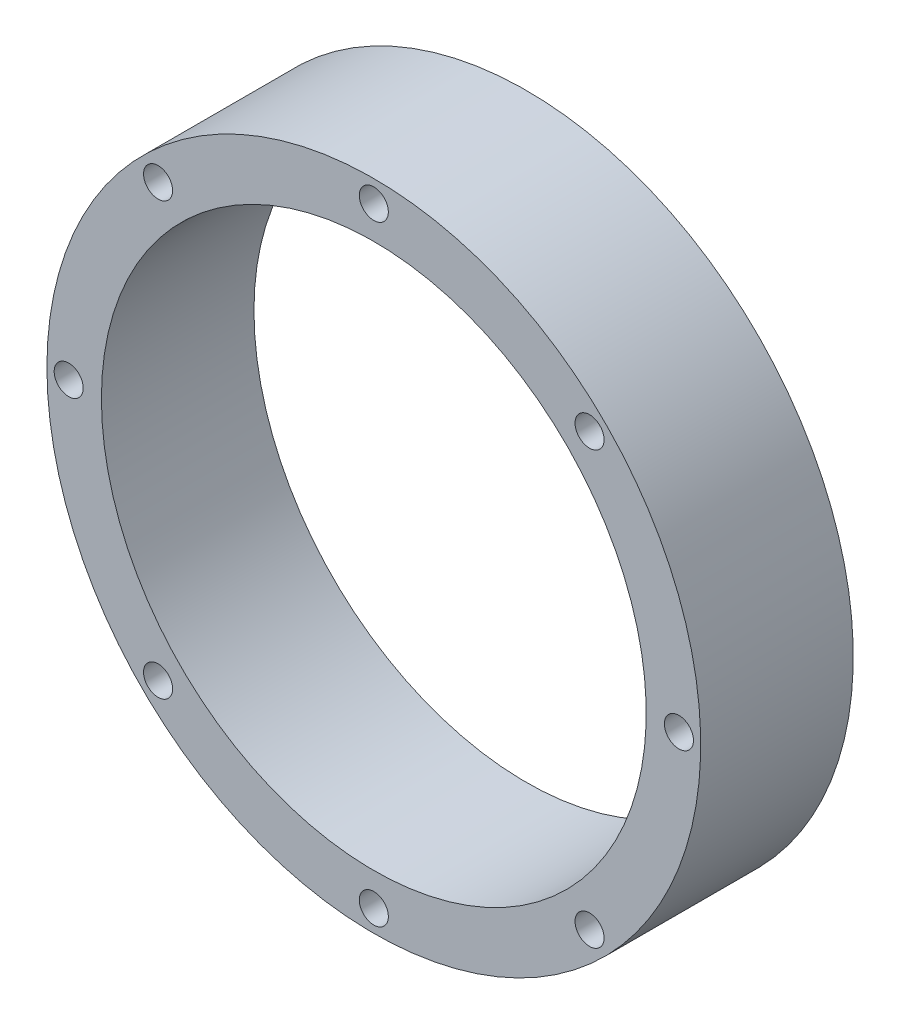
ISO-10303-21;
HEADER;
FILE_DESCRIPTION(('STEP AP214'),'2;1');
FILE_NAME('part.step','',(''),(''),'','','');
FILE_SCHEMA(('AUTOMOTIVE_DESIGN { 1 0 10303 214 1 1 1 1 }'));
ENDSEC;
DATA;
#1=APPLICATION_CONTEXT('core data for automotive mechanical design processes');
#2=APPLICATION_PROTOCOL_DEFINITION('international standard','automotive_design',2000,#1);
#3=PRODUCT_CONTEXT('',#1,'mechanical');
#4=PRODUCT('Part','Part','',(#3));
#5=PRODUCT_RELATED_PRODUCT_CATEGORY('part','',(#4));
#6=PRODUCT_DEFINITION_FORMATION('','',#4);
#7=PRODUCT_DEFINITION_CONTEXT('part definition',#1,'design');
#8=PRODUCT_DEFINITION('design','',#6,#7);
#9=PRODUCT_DEFINITION_SHAPE('','',#8);
#10=(LENGTH_UNIT() NAMED_UNIT(*) SI_UNIT(.MILLI.,.METRE.));
#11=(NAMED_UNIT(*) PLANE_ANGLE_UNIT() SI_UNIT($,.RADIAN.));
#12=(NAMED_UNIT(*) SI_UNIT($,.STERADIAN.) SOLID_ANGLE_UNIT());
#13=UNCERTAINTY_MEASURE_WITH_UNIT(LENGTH_MEASURE(1.E-05),#10,'distance_accuracy_value','');
#14=(GEOMETRIC_REPRESENTATION_CONTEXT(3) GLOBAL_UNCERTAINTY_ASSIGNED_CONTEXT((#13)) GLOBAL_UNIT_ASSIGNED_CONTEXT((#10,
#11,#12)) REPRESENTATION_CONTEXT('',''));
#15=CARTESIAN_POINT('',(0.,0.,0.));
#16=DIRECTION('',(0.,0.,1.));
#17=DIRECTION('',(1.,0.,0.));
#18=AXIS2_PLACEMENT_3D('',#15,#16,#17);
#19=CARTESIAN_POINT('',(0.,0.,21.));
#20=DIRECTION('',(0.,0.,1.));
#21=DIRECTION('',(1.,0.,0.));
#22=AXIS2_PLACEMENT_3D('',#19,#20,#21);
#23=PLANE('',#22);
#24=CARTESIAN_POINT('',(-29.6984848098345,29.6984848098337,21.));
#25=DIRECTION('',(0.,0.,-1.));
#26=DIRECTION('',(-1.,0.,0.));
#27=AXIS2_PLACEMENT_3D('',#24,#25,#26);
#28=CIRCLE('',#27,1.99999999999999);
#29=CARTESIAN_POINT('',(-31.6984848098345,29.6984848098337,21.));
#30=VERTEX_POINT('',#29);
#31=EDGE_CURVE('E150',#30,#30,#28,.T.);
#32=ORIENTED_EDGE('',*,*,#31,.T.);
#33=EDGE_LOOP('',(#32));
#34=FACE_BOUND('',#33,.T.);
#35=CARTESIAN_POINT('',(0.,42.,21.));
#36=DIRECTION('',(0.,0.,-1.));
#37=DIRECTION('',(-1.,0.,0.));
#38=AXIS2_PLACEMENT_3D('',#35,#36,#37);
#39=CIRCLE('',#38,2.);
#40=CARTESIAN_POINT('',(-2.,42.,21.));
#41=VERTEX_POINT('',#40);
#42=EDGE_CURVE('E138',#41,#41,#39,.T.);
#43=ORIENTED_EDGE('',*,*,#42,.T.);
#44=EDGE_LOOP('',(#43));
#45=FACE_BOUND('',#44,.T.);
#46=CARTESIAN_POINT('',(0.,0.,21.));
#47=DIRECTION('',(0.,0.,1.));
#48=DIRECTION('',(1.,0.,0.));
#49=AXIS2_PLACEMENT_3D('',#46,#47,#48);
#50=CIRCLE('',#49,37.5);
#51=CARTESIAN_POINT('',(-37.5,0.,21.));
#52=VERTEX_POINT('',#51);
#53=EDGE_CURVE('E10',#52,#52,#50,.T.);
#54=ORIENTED_EDGE('',*,*,#53,.F.);
#55=EDGE_LOOP('',(#54));
#56=FACE_BOUND('',#55,.T.);
#57=CARTESIAN_POINT('',(0.,0.,21.));
#58=DIRECTION('',(0.,0.,1.));
#59=DIRECTION('',(1.,0.,0.));
#60=AXIS2_PLACEMENT_3D('',#57,#58,#59);
#61=CIRCLE('',#60,45.);
#62=CARTESIAN_POINT('',(-45.,0.,21.));
#63=VERTEX_POINT('',#62);
#64=EDGE_CURVE('E49',#63,#63,#61,.T.);
#65=ORIENTED_EDGE('',*,*,#64,.T.);
#66=EDGE_LOOP('',(#65));
#67=FACE_BOUND('',#66,.T.);
#68=CARTESIAN_POINT('',(-41.9999999999982,-1.78799593583724E-12,21.));
#69=DIRECTION('',(0.,0.,-1.));
#70=DIRECTION('',(-1.,0.,0.));
#71=AXIS2_PLACEMENT_3D('',#68,#69,#70);
#72=CIRCLE('',#71,1.99999999999999);
#73=CARTESIAN_POINT('',(-43.9999999999982,-1.78799593583724E-12,21.));
#74=VERTEX_POINT('',#73);
#75=EDGE_CURVE('E60',#74,#74,#72,.T.);
#76=ORIENTED_EDGE('',*,*,#75,.T.);
#77=EDGE_LOOP('',(#76));
#78=FACE_BOUND('',#77,.T.);
#79=CARTESIAN_POINT('',(-29.698484809832,-29.6984848098363,21.));
#80=DIRECTION('',(0.,0.,-1.));
#81=DIRECTION('',(-1.,0.,0.));
#82=AXIS2_PLACEMENT_3D('',#79,#80,#81);
#83=CIRCLE('',#82,1.99999999999999);
#84=CARTESIAN_POINT('',(-31.6984848098319,-29.6984848098363,21.));
#85=VERTEX_POINT('',#84);
#86=EDGE_CURVE('E78',#85,#85,#83,.T.);
#87=ORIENTED_EDGE('',*,*,#86,.T.);
#88=EDGE_LOOP('',(#87));
#89=FACE_BOUND('',#88,.T.);
#90=CARTESIAN_POINT('',(3.56570483856165E-12,-42.,21.));
#91=DIRECTION('',(0.,0.,-1.));
#92=DIRECTION('',(-1.,0.,0.));
#93=AXIS2_PLACEMENT_3D('',#90,#91,#92);
#94=CIRCLE('',#93,2.);
#95=CARTESIAN_POINT('',(-1.99999999999643,-42.,21.));
#96=VERTEX_POINT('',#95);
#97=EDGE_CURVE('E90',#96,#96,#94,.T.);
#98=ORIENTED_EDGE('',*,*,#97,.T.);
#99=EDGE_LOOP('',(#98));
#100=FACE_BOUND('',#99,.T.);
#101=CARTESIAN_POINT('',(29.698484809838,-29.6984848098337,21.));
#102=DIRECTION('',(0.,0.,-1.));
#103=DIRECTION('',(-1.,0.,0.));
#104=AXIS2_PLACEMENT_3D('',#101,#102,#103);
#105=CIRCLE('',#104,2.);
#106=CARTESIAN_POINT('',(27.698484809838,-29.6984848098337,21.));
#107=VERTEX_POINT('',#106);
#108=EDGE_CURVE('E102',#107,#107,#105,.T.);
#109=ORIENTED_EDGE('',*,*,#108,.T.);
#110=EDGE_LOOP('',(#109));
#111=FACE_BOUND('',#110,.T.);
#112=CARTESIAN_POINT('',(42.0000000000018,1.78285241928082E-12,21.));
#113=DIRECTION('',(0.,0.,-1.));
#114=DIRECTION('',(-1.,0.,0.));
#115=AXIS2_PLACEMENT_3D('',#112,#113,#114);
#116=CIRCLE('',#115,1.99999999999999);
#117=CARTESIAN_POINT('',(40.0000000000018,1.78285241928082E-12,21.));
#118=VERTEX_POINT('',#117);
#119=EDGE_CURVE('E114',#118,#118,#116,.T.);
#120=ORIENTED_EDGE('',*,*,#119,.T.);
#121=EDGE_LOOP('',(#120));
#122=FACE_BOUND('',#121,.T.);
#123=CARTESIAN_POINT('',(29.6984848098355,29.6984848098363,21.));
#124=DIRECTION('',(0.,0.,-1.));
#125=DIRECTION('',(-1.,0.,0.));
#126=AXIS2_PLACEMENT_3D('',#123,#124,#125);
#127=CIRCLE('',#126,2.);
#128=CARTESIAN_POINT('',(27.6984848098355,29.6984848098363,21.));
#129=VERTEX_POINT('',#128);
#130=EDGE_CURVE('E126',#129,#129,#127,.T.);
#131=ORIENTED_EDGE('',*,*,#130,.T.);
#132=EDGE_LOOP('',(#131));
#133=FACE_BOUND('',#132,.T.);
#134=ADVANCED_FACE('F40',(#34,#45,#56,#67,#78,#89,#100,#111,#122,#133),#23,.T.);
#135=CARTESIAN_POINT('',(0.,0.,21.));
#136=DIRECTION('',(0.,0.,-1.));
#137=DIRECTION('',(-1.,0.,0.));
#138=AXIS2_PLACEMENT_3D('',#135,#136,#137);
#139=CYLINDRICAL_SURFACE('',#138,45.);
#140=CARTESIAN_POINT('',(0.,0.,0.));
#141=DIRECTION('',(0.,0.,1.));
#142=DIRECTION('',(1.,0.,0.));
#143=AXIS2_PLACEMENT_3D('',#140,#141,#142);
#144=CIRCLE('',#143,45.);
#145=CARTESIAN_POINT('',(-45.,0.,0.));
#146=VERTEX_POINT('',#145);
#147=EDGE_CURVE('E57',#146,#146,#144,.T.);
#148=CARTESIAN_POINT('',(-45.,0.,21.));
#149=CARTESIAN_POINT('',(-45.,0.,20.78125));
#150=CARTESIAN_POINT('',(-45.,0.,20.5625));
#151=CARTESIAN_POINT('',(-45.,0.,20.125));
#152=CARTESIAN_POINT('',(-45.,0.,19.90625));
#153=CARTESIAN_POINT('',(-45.,0.,19.46875));
#154=CARTESIAN_POINT('',(-45.,0.,19.25));
#155=CARTESIAN_POINT('',(-45.,0.,18.8125));
#156=CARTESIAN_POINT('',(-45.,0.,18.59375));
#157=CARTESIAN_POINT('',(-45.,0.,18.15625));
#158=CARTESIAN_POINT('',(-45.,0.,17.9375));
#159=CARTESIAN_POINT('',(-45.,0.,17.5));
#160=CARTESIAN_POINT('',(-45.,0.,17.28125));
#161=CARTESIAN_POINT('',(-45.,0.,16.84375));
#162=CARTESIAN_POINT('',(-45.,0.,16.625));
#163=CARTESIAN_POINT('',(-45.,0.,16.1875));
#164=CARTESIAN_POINT('',(-45.,0.,15.96875));
#165=CARTESIAN_POINT('',(-45.,0.,15.53125));
#166=CARTESIAN_POINT('',(-45.,0.,15.3125));
#167=CARTESIAN_POINT('',(-45.,0.,14.875));
#168=CARTESIAN_POINT('',(-45.,0.,14.65625));
#169=CARTESIAN_POINT('',(-45.,0.,14.21875));
#170=CARTESIAN_POINT('',(-45.,0.,14.));
#171=CARTESIAN_POINT('',(-45.,0.,13.5625));
#172=CARTESIAN_POINT('',(-45.,0.,13.34375));
#173=CARTESIAN_POINT('',(-45.,0.,12.90625));
#174=CARTESIAN_POINT('',(-45.,0.,12.6875));
#175=CARTESIAN_POINT('',(-45.,0.,12.25));
#176=CARTESIAN_POINT('',(-45.,0.,12.03125));
#177=CARTESIAN_POINT('',(-45.,0.,11.59375));
#178=CARTESIAN_POINT('',(-45.,0.,11.375));
#179=CARTESIAN_POINT('',(-45.,0.,10.9375));
#180=CARTESIAN_POINT('',(-45.,0.,10.71875));
#181=CARTESIAN_POINT('',(-45.,0.,10.28125));
#182=CARTESIAN_POINT('',(-45.,0.,10.0625));
#183=CARTESIAN_POINT('',(-45.,0.,9.625));
#184=CARTESIAN_POINT('',(-45.,0.,9.40625));
#185=CARTESIAN_POINT('',(-45.,0.,8.96875));
#186=CARTESIAN_POINT('',(-45.,0.,8.75));
#187=CARTESIAN_POINT('',(-45.,0.,8.3125));
#188=CARTESIAN_POINT('',(-45.,0.,8.09375));
#189=CARTESIAN_POINT('',(-45.,0.,7.65625));
#190=CARTESIAN_POINT('',(-45.,0.,7.4375));
#191=CARTESIAN_POINT('',(-45.,0.,7.));
#192=CARTESIAN_POINT('',(-45.,0.,6.78125));
#193=CARTESIAN_POINT('',(-45.,0.,6.34375));
#194=CARTESIAN_POINT('',(-45.,0.,6.125));
#195=CARTESIAN_POINT('',(-45.,0.,5.6875));
#196=CARTESIAN_POINT('',(-45.,0.,5.46875));
#197=CARTESIAN_POINT('',(-45.,0.,5.03125));
#198=CARTESIAN_POINT('',(-45.,0.,4.8125));
#199=CARTESIAN_POINT('',(-45.,0.,4.375));
#200=CARTESIAN_POINT('',(-45.,0.,4.15625));
#201=CARTESIAN_POINT('',(-45.,0.,3.71875));
#202=CARTESIAN_POINT('',(-45.,0.,3.5));
#203=CARTESIAN_POINT('',(-45.,0.,3.0625));
#204=CARTESIAN_POINT('',(-45.,0.,2.84375));
#205=CARTESIAN_POINT('',(-45.,0.,2.40625));
#206=CARTESIAN_POINT('',(-45.,0.,2.1875));
#207=CARTESIAN_POINT('',(-45.,0.,1.75));
#208=CARTESIAN_POINT('',(-45.,0.,1.53125));
#209=CARTESIAN_POINT('',(-45.,0.,1.09375));
#210=CARTESIAN_POINT('',(-45.,0.,0.875000000000001));
#211=CARTESIAN_POINT('',(-45.,0.,0.4375));
#212=CARTESIAN_POINT('',(-45.,0.,0.21875));
#213=CARTESIAN_POINT('',(-45.,0.,0.));
#214=B_SPLINE_CURVE_WITH_KNOTS('',3,(#148,#149,#150,#151,#152,#153,#154,#155,#156,#157,#158,
#159,#160,#161,#162,#163,#164,#165,#166,#167,#168,#169,#170,#171,#172,#173,#174,#175,#176,#177,
#178,#179,#180,#181,#182,#183,#184,#185,#186,#187,#188,#189,#190,#191,#192,#193,#194,#195,#196,
#197,#198,#199,#200,#201,#202,#203,#204,#205,#206,#207,#208,#209,#210,#211,#212,#213),
.UNSPECIFIED.,.F.,.F.,(4,2,2,2,2,2,2,2,2,2,2,2,2,2,2,2,2,2,2,2,2,2,2,2,2,2,2,2,2,2,2,2,4),(0.,
0.656250000000001,1.3125,1.96875,2.625,3.28125,3.9375,4.59375,5.25,5.90625,6.5625,7.21875,7.875,
8.53125,9.1875,9.84375,10.5,11.15625,11.8125,12.46875,13.125,13.78125,14.4375,15.09375,15.75,
16.40625,17.0625,17.71875,18.375,19.03125,19.6875,20.34375,21.),.UNSPECIFIED.);
#215=EDGE_CURVE('BSEAM42',#63,#146,#214,.T.);
#216=ORIENTED_EDGE('',*,*,#64,.F.);
#217=ORIENTED_EDGE('',*,*,#147,.T.);
#218=ORIENTED_EDGE('',*,*,#215,.T.);
#219=ORIENTED_EDGE('',*,*,#215,.F.);
#220=EDGE_LOOP('',(#216,#218,#217,#219));
#221=FACE_BOUND('',#220,.T.);
#222=ADVANCED_FACE('F42',(#221),#139,.T.);
#223=CARTESIAN_POINT('',(0.,0.,21.));
#224=DIRECTION('',(0.,0.,-1.));
#225=DIRECTION('',(-1.,0.,0.));
#226=AXIS2_PLACEMENT_3D('',#223,#224,#225);
#227=CYLINDRICAL_SURFACE('',#226,37.5);
#228=CARTESIAN_POINT('',(0.,0.,0.));
#229=DIRECTION('',(0.,0.,1.));
#230=DIRECTION('',(1.,0.,0.));
#231=AXIS2_PLACEMENT_3D('',#228,#229,#230);
#232=CIRCLE('',#231,37.5);
#233=CARTESIAN_POINT('',(-37.5,0.,0.));
#234=VERTEX_POINT('',#233);
#235=EDGE_CURVE('E44',#234,#234,#232,.T.);
#236=CARTESIAN_POINT('',(-37.5,0.,21.));
#237=CARTESIAN_POINT('',(-37.5,0.,20.78125));
#238=CARTESIAN_POINT('',(-37.5,0.,20.5625));
#239=CARTESIAN_POINT('',(-37.5,0.,20.125));
#240=CARTESIAN_POINT('',(-37.5,0.,19.90625));
#241=CARTESIAN_POINT('',(-37.5,0.,19.46875));
#242=CARTESIAN_POINT('',(-37.5,0.,19.25));
#243=CARTESIAN_POINT('',(-37.5,0.,18.8125));
#244=CARTESIAN_POINT('',(-37.5,0.,18.59375));
#245=CARTESIAN_POINT('',(-37.5,0.,18.15625));
#246=CARTESIAN_POINT('',(-37.5,0.,17.9375));
#247=CARTESIAN_POINT('',(-37.5,0.,17.5));
#248=CARTESIAN_POINT('',(-37.5,0.,17.28125));
#249=CARTESIAN_POINT('',(-37.5,0.,16.84375));
#250=CARTESIAN_POINT('',(-37.5,0.,16.625));
#251=CARTESIAN_POINT('',(-37.5,0.,16.1875));
#252=CARTESIAN_POINT('',(-37.5,0.,15.96875));
#253=CARTESIAN_POINT('',(-37.5,0.,15.53125));
#254=CARTESIAN_POINT('',(-37.5,0.,15.3125));
#255=CARTESIAN_POINT('',(-37.5,0.,14.875));
#256=CARTESIAN_POINT('',(-37.5,0.,14.65625));
#257=CARTESIAN_POINT('',(-37.5,0.,14.21875));
#258=CARTESIAN_POINT('',(-37.5,0.,14.));
#259=CARTESIAN_POINT('',(-37.5,0.,13.5625));
#260=CARTESIAN_POINT('',(-37.5,0.,13.34375));
#261=CARTESIAN_POINT('',(-37.5,0.,12.90625));
#262=CARTESIAN_POINT('',(-37.5,0.,12.6875));
#263=CARTESIAN_POINT('',(-37.5,0.,12.25));
#264=CARTESIAN_POINT('',(-37.5,0.,12.03125));
#265=CARTESIAN_POINT('',(-37.5,0.,11.59375));
#266=CARTESIAN_POINT('',(-37.5,0.,11.375));
#267=CARTESIAN_POINT('',(-37.5,0.,10.9375));
#268=CARTESIAN_POINT('',(-37.5,0.,10.71875));
#269=CARTESIAN_POINT('',(-37.5,0.,10.28125));
#270=CARTESIAN_POINT('',(-37.5,0.,10.0625));
#271=CARTESIAN_POINT('',(-37.5,0.,9.625));
#272=CARTESIAN_POINT('',(-37.5,0.,9.40625));
#273=CARTESIAN_POINT('',(-37.5,0.,8.96875));
#274=CARTESIAN_POINT('',(-37.5,0.,8.75));
#275=CARTESIAN_POINT('',(-37.5,0.,8.3125));
#276=CARTESIAN_POINT('',(-37.5,0.,8.09375));
#277=CARTESIAN_POINT('',(-37.5,0.,7.65625));
#278=CARTESIAN_POINT('',(-37.5,0.,7.4375));
#279=CARTESIAN_POINT('',(-37.5,0.,7.));
#280=CARTESIAN_POINT('',(-37.5,0.,6.78125));
#281=CARTESIAN_POINT('',(-37.5,0.,6.34375));
#282=CARTESIAN_POINT('',(-37.5,0.,6.125));
#283=CARTESIAN_POINT('',(-37.5,0.,5.6875));
#284=CARTESIAN_POINT('',(-37.5,0.,5.46875));
#285=CARTESIAN_POINT('',(-37.5,0.,5.03125));
#286=CARTESIAN_POINT('',(-37.5,0.,4.8125));
#287=CARTESIAN_POINT('',(-37.5,0.,4.375));
#288=CARTESIAN_POINT('',(-37.5,0.,4.15625));
#289=CARTESIAN_POINT('',(-37.5,0.,3.71875));
#290=CARTESIAN_POINT('',(-37.5,0.,3.5));
#291=CARTESIAN_POINT('',(-37.5,0.,3.0625));
#292=CARTESIAN_POINT('',(-37.5,0.,2.84375));
#293=CARTESIAN_POINT('',(-37.5,0.,2.40625));
#294=CARTESIAN_POINT('',(-37.5,0.,2.1875));
#295=CARTESIAN_POINT('',(-37.5,0.,1.75));
#296=CARTESIAN_POINT('',(-37.5,0.,1.53125));
#297=CARTESIAN_POINT('',(-37.5,0.,1.09375));
#298=CARTESIAN_POINT('',(-37.5,0.,0.875000000000001));
#299=CARTESIAN_POINT('',(-37.5,0.,0.4375));
#300=CARTESIAN_POINT('',(-37.5,0.,0.21875));
#301=CARTESIAN_POINT('',(-37.5,0.,0.));
#302=B_SPLINE_CURVE_WITH_KNOTS('',3,(#236,#237,#238,#239,#240,#241,#242,#243,#244,#245,#246,
#247,#248,#249,#250,#251,#252,#253,#254,#255,#256,#257,#258,#259,#260,#261,#262,#263,#264,#265,
#266,#267,#268,#269,#270,#271,#272,#273,#274,#275,#276,#277,#278,#279,#280,#281,#282,#283,#284,
#285,#286,#287,#288,#289,#290,#291,#292,#293,#294,#295,#296,#297,#298,#299,#300,#301),
.UNSPECIFIED.,.F.,.F.,(4,2,2,2,2,2,2,2,2,2,2,2,2,2,2,2,2,2,2,2,2,2,2,2,2,2,2,2,2,2,2,2,4),(0.,
0.656249999999997,1.3125,1.96875,2.625,3.28125,3.9375,4.59375,5.25,5.90625,6.5625,7.21875,7.875,
8.53125,9.1875,9.84375,10.5,11.15625,11.8125,12.46875,13.125,13.78125,14.4375,15.09375,15.75,
16.40625,17.0625,17.71875,18.375,19.03125,19.6875,20.34375,21.),.UNSPECIFIED.);
#303=EDGE_CURVE('BSEAM169',#52,#234,#302,.T.);
#304=ORIENTED_EDGE('',*,*,#53,.T.);
#305=ORIENTED_EDGE('',*,*,#235,.F.);
#306=ORIENTED_EDGE('',*,*,#303,.T.);
#307=ORIENTED_EDGE('',*,*,#303,.F.);
#308=EDGE_LOOP('',(#304,#306,#305,#307));
#309=FACE_BOUND('',#308,.T.);
#310=ADVANCED_FACE('F169',(#309),#227,.F.);
#311=CARTESIAN_POINT('',(0.,0.,0.));
#312=DIRECTION('',(0.,0.,1.));
#313=DIRECTION('',(1.,0.,0.));
#314=AXIS2_PLACEMENT_3D('',#311,#312,#313);
#315=PLANE('',#314);
#316=CARTESIAN_POINT('',(-29.6984848098345,29.6984848098337,0.));
#317=DIRECTION('',(0.,0.,-1.));
#318=DIRECTION('',(-1.,0.,0.));
#319=AXIS2_PLACEMENT_3D('',#316,#317,#318);
#320=CIRCLE('',#319,2.025);
#321=CARTESIAN_POINT('',(-31.7234848098345,29.6984848098337,0.));
#322=VERTEX_POINT('',#321);
#323=EDGE_CURVE('E158',#322,#322,#320,.T.);
#324=ORIENTED_EDGE('',*,*,#323,.F.);
#325=EDGE_LOOP('',(#324));
#326=FACE_BOUND('',#325,.T.);
#327=CARTESIAN_POINT('',(0.,42.,0.));
#328=DIRECTION('',(0.,0.,-1.));
#329=DIRECTION('',(-1.,0.,0.));
#330=AXIS2_PLACEMENT_3D('',#327,#328,#329);
#331=CIRCLE('',#330,2.025);
#332=CARTESIAN_POINT('',(-2.025,42.,0.));
#333=VERTEX_POINT('',#332);
#334=EDGE_CURVE('E146',#333,#333,#331,.T.);
#335=ORIENTED_EDGE('',*,*,#334,.F.);
#336=EDGE_LOOP('',(#335));
#337=FACE_BOUND('',#336,.T.);
#338=CARTESIAN_POINT('',(29.6984848098355,29.6984848098363,0.));
#339=DIRECTION('',(0.,0.,-1.));
#340=DIRECTION('',(-1.,0.,0.));
#341=AXIS2_PLACEMENT_3D('',#338,#339,#340);
#342=CIRCLE('',#341,2.025);
#343=CARTESIAN_POINT('',(27.6734848098355,29.6984848098363,0.));
#344=VERTEX_POINT('',#343);
#345=EDGE_CURVE('E134',#344,#344,#342,.T.);
#346=ORIENTED_EDGE('',*,*,#345,.F.);
#347=EDGE_LOOP('',(#346));
#348=FACE_BOUND('',#347,.T.);
#349=CARTESIAN_POINT('',(42.0000000000018,1.78285241928082E-12,0.));
#350=DIRECTION('',(0.,0.,-1.));
#351=DIRECTION('',(-1.,0.,0.));
#352=AXIS2_PLACEMENT_3D('',#349,#350,#351);
#353=CIRCLE('',#352,2.025);
#354=CARTESIAN_POINT('',(39.9750000000018,1.78285241928082E-12,0.));
#355=VERTEX_POINT('',#354);
#356=EDGE_CURVE('E122',#355,#355,#353,.T.);
#357=ORIENTED_EDGE('',*,*,#356,.F.);
#358=EDGE_LOOP('',(#357));
#359=FACE_BOUND('',#358,.T.);
#360=CARTESIAN_POINT('',(29.698484809838,-29.6984848098337,0.));
#361=DIRECTION('',(0.,0.,-1.));
#362=DIRECTION('',(-1.,0.,0.));
#363=AXIS2_PLACEMENT_3D('',#360,#361,#362);
#364=CIRCLE('',#363,2.025);
#365=CARTESIAN_POINT('',(27.673484809838,-29.6984848098337,0.));
#366=VERTEX_POINT('',#365);
#367=EDGE_CURVE('E110',#366,#366,#364,.T.);
#368=ORIENTED_EDGE('',*,*,#367,.F.);
#369=EDGE_LOOP('',(#368));
#370=FACE_BOUND('',#369,.T.);
#371=CARTESIAN_POINT('',(3.56570483856165E-12,-42.,0.));
#372=DIRECTION('',(0.,0.,-1.));
#373=DIRECTION('',(-1.,0.,0.));
#374=AXIS2_PLACEMENT_3D('',#371,#372,#373);
#375=CIRCLE('',#374,2.025);
#376=CARTESIAN_POINT('',(-2.02499999999643,-42.,0.));
#377=VERTEX_POINT('',#376);
#378=EDGE_CURVE('E98',#377,#377,#375,.T.);
#379=ORIENTED_EDGE('',*,*,#378,.F.);
#380=EDGE_LOOP('',(#379));
#381=FACE_BOUND('',#380,.T.);
#382=CARTESIAN_POINT('',(-29.698484809832,-29.6984848098363,0.));
#383=DIRECTION('',(0.,0.,-1.));
#384=DIRECTION('',(-1.,0.,0.));
#385=AXIS2_PLACEMENT_3D('',#382,#383,#384);
#386=CIRCLE('',#385,2.025);
#387=CARTESIAN_POINT('',(-31.723484809832,-29.6984848098363,0.));
#388=VERTEX_POINT('',#387);
#389=EDGE_CURVE('E86',#388,#388,#386,.T.);
#390=ORIENTED_EDGE('',*,*,#389,.F.);
#391=EDGE_LOOP('',(#390));
#392=FACE_BOUND('',#391,.T.);
#393=CARTESIAN_POINT('',(-41.9999999999982,-1.78799593583724E-12,0.));
#394=DIRECTION('',(0.,0.,-1.));
#395=DIRECTION('',(-1.,0.,0.));
#396=AXIS2_PLACEMENT_3D('',#393,#394,#395);
#397=CIRCLE('',#396,2.025);
#398=CARTESIAN_POINT('',(-44.0249999999982,-1.78799593583724E-12,0.));
#399=VERTEX_POINT('',#398);
#400=EDGE_CURVE('E72',#399,#399,#397,.T.);
#401=ORIENTED_EDGE('',*,*,#400,.F.);
#402=EDGE_LOOP('',(#401));
#403=FACE_BOUND('',#402,.T.);
#404=ORIENTED_EDGE('',*,*,#147,.F.);
#405=EDGE_LOOP('',(#404));
#406=FACE_BOUND('',#405,.T.);
#407=ORIENTED_EDGE('',*,*,#235,.T.);
#408=EDGE_LOOP('',(#407));
#409=FACE_BOUND('',#408,.T.);
#410=ADVANCED_FACE('F165',(#326,#337,#348,#359,#370,#381,#392,#403,#406,#409),#315,.F.);
#411=CARTESIAN_POINT('',(-41.9999999999982,-1.78799593583724E-12,0.));
#412=DIRECTION('',(0.,0.,-1.));
#413=DIRECTION('',(-1.,0.,0.));
#414=AXIS2_PLACEMENT_3D('',#411,#412,#413);
#415=CYLINDRICAL_SURFACE('',#414,2.);
#416=ORIENTED_EDGE('',*,*,#75,.F.);
#417=EDGE_LOOP('',(#416));
#418=FACE_BOUND('',#417,.T.);
#419=CARTESIAN_POINT('',(-41.9999999999982,-1.78799593583724E-12,0.0250000000000025));
#420=DIRECTION('',(0.,0.,-1.));
#421=DIRECTION('',(-1.,0.,0.));
#422=AXIS2_PLACEMENT_3D('',#419,#420,#421);
#423=CIRCLE('',#422,2.);
#424=CARTESIAN_POINT('',(-43.9999999999982,-1.78799593583724E-12,0.0250000000000025));
#425=VERTEX_POINT('',#424);
#426=EDGE_CURVE('E67',#425,#425,#423,.T.);
#427=ORIENTED_EDGE('',*,*,#426,.T.);
#428=EDGE_LOOP('',(#427));
#429=FACE_BOUND('',#428,.T.);
#430=ADVANCED_FACE('F168',(#418,#429),#415,.F.);
#431=CARTESIAN_POINT('',(-41.9999999999982,-1.78799593583724E-12,0.));
#432=DIRECTION('',(0.,0.,-1.));
#433=DIRECTION('',(-1.,0.,0.));
#434=AXIS2_PLACEMENT_3D('',#431,#432,#433);
#435=CONICAL_SURFACE('',#434,2.025,0.785398163397344);
#436=ORIENTED_EDGE('',*,*,#426,.F.);
#437=EDGE_LOOP('',(#436));
#438=FACE_BOUND('',#437,.T.);
#439=ORIENTED_EDGE('',*,*,#400,.T.);
#440=EDGE_LOOP('',(#439));
#441=FACE_BOUND('',#440,.T.);
#442=ADVANCED_FACE('F202',(#438,#441),#435,.F.);
#443=CARTESIAN_POINT('',(-29.698484809832,-29.6984848098363,0.));
#444=DIRECTION('',(0.,0.,-1.));
#445=DIRECTION('',(-1.,0.,0.));
#446=AXIS2_PLACEMENT_3D('',#443,#444,#445);
#447=CYLINDRICAL_SURFACE('',#446,2.);
#448=ORIENTED_EDGE('',*,*,#86,.F.);
#449=EDGE_LOOP('',(#448));
#450=FACE_BOUND('',#449,.T.);
#451=CARTESIAN_POINT('',(-29.698484809832,-29.6984848098363,0.0250000000000025));
#452=DIRECTION('',(0.,0.,-1.));
#453=DIRECTION('',(-1.,0.,0.));
#454=AXIS2_PLACEMENT_3D('',#451,#452,#453);
#455=CIRCLE('',#454,2.);
#456=CARTESIAN_POINT('',(-31.6984848098319,-29.6984848098363,0.0250000000000025));
#457=VERTEX_POINT('',#456);
#458=EDGE_CURVE('E82',#457,#457,#455,.T.);
#459=ORIENTED_EDGE('',*,*,#458,.T.);
#460=EDGE_LOOP('',(#459));
#461=FACE_BOUND('',#460,.T.);
#462=ADVANCED_FACE('F206',(#450,#461),#447,.F.);
#463=CARTESIAN_POINT('',(-29.698484809832,-29.6984848098363,0.));
#464=DIRECTION('',(0.,0.,-1.));
#465=DIRECTION('',(-1.,0.,0.));
#466=AXIS2_PLACEMENT_3D('',#463,#464,#465);
#467=CONICAL_SURFACE('',#466,2.025,0.785398163397414);
#468=ORIENTED_EDGE('',*,*,#458,.F.);
#469=EDGE_LOOP('',(#468));
#470=FACE_BOUND('',#469,.T.);
#471=ORIENTED_EDGE('',*,*,#389,.T.);
#472=EDGE_LOOP('',(#471));
#473=FACE_BOUND('',#472,.T.);
#474=ADVANCED_FACE('F210',(#470,#473),#467,.F.);
#475=CARTESIAN_POINT('',(3.56570483856165E-12,-42.,0.));
#476=DIRECTION('',(0.,0.,-1.));
#477=DIRECTION('',(-1.,0.,0.));
#478=AXIS2_PLACEMENT_3D('',#475,#476,#477);
#479=CYLINDRICAL_SURFACE('',#478,2.);
#480=ORIENTED_EDGE('',*,*,#97,.F.);
#481=EDGE_LOOP('',(#480));
#482=FACE_BOUND('',#481,.T.);
#483=CARTESIAN_POINT('',(3.56570483856165E-12,-42.,0.0250000000000025));
#484=DIRECTION('',(0.,0.,-1.));
#485=DIRECTION('',(-1.,0.,0.));
#486=AXIS2_PLACEMENT_3D('',#483,#484,#485);
#487=CIRCLE('',#486,2.);
#488=CARTESIAN_POINT('',(-1.99999999999643,-42.,0.0250000000000025));
#489=VERTEX_POINT('',#488);
#490=EDGE_CURVE('E94',#489,#489,#487,.T.);
#491=ORIENTED_EDGE('',*,*,#490,.T.);
#492=EDGE_LOOP('',(#491));
#493=FACE_BOUND('',#492,.T.);
#494=ADVANCED_FACE('F214',(#482,#493),#479,.F.);
#495=CARTESIAN_POINT('',(3.56570483856165E-12,-42.,0.));
#496=DIRECTION('',(0.,0.,-1.));
#497=DIRECTION('',(-1.,0.,0.));
#498=AXIS2_PLACEMENT_3D('',#495,#496,#497);
#499=CONICAL_SURFACE('',#498,2.025,0.785398163397414);
#500=ORIENTED_EDGE('',*,*,#490,.F.);
#501=EDGE_LOOP('',(#500));
#502=FACE_BOUND('',#501,.T.);
#503=ORIENTED_EDGE('',*,*,#378,.T.);
#504=EDGE_LOOP('',(#503));
#505=FACE_BOUND('',#504,.T.);
#506=ADVANCED_FACE('F218',(#502,#505),#499,.F.);
#507=CARTESIAN_POINT('',(29.698484809838,-29.6984848098337,0.));
#508=DIRECTION('',(0.,0.,-1.));
#509=DIRECTION('',(-1.,0.,0.));
#510=AXIS2_PLACEMENT_3D('',#507,#508,#509);
#511=CYLINDRICAL_SURFACE('',#510,2.);
#512=ORIENTED_EDGE('',*,*,#108,.F.);
#513=EDGE_LOOP('',(#512));
#514=FACE_BOUND('',#513,.T.);
#515=CARTESIAN_POINT('',(29.698484809838,-29.6984848098337,0.0250000000000025));
#516=DIRECTION('',(0.,0.,-1.));
#517=DIRECTION('',(-1.,0.,0.));
#518=AXIS2_PLACEMENT_3D('',#515,#516,#517);
#519=CIRCLE('',#518,2.);
#520=CARTESIAN_POINT('',(27.698484809838,-29.6984848098337,0.0250000000000025));
#521=VERTEX_POINT('',#520);
#522=EDGE_CURVE('E106',#521,#521,#519,.T.);
#523=ORIENTED_EDGE('',*,*,#522,.T.);
#524=EDGE_LOOP('',(#523));
#525=FACE_BOUND('',#524,.T.);
#526=ADVANCED_FACE('F222',(#514,#525),#511,.F.);
#527=CARTESIAN_POINT('',(29.698484809838,-29.6984848098337,0.));
#528=DIRECTION('',(0.,0.,-1.));
#529=DIRECTION('',(-1.,0.,0.));
#530=AXIS2_PLACEMENT_3D('',#527,#528,#529);
#531=CONICAL_SURFACE('',#530,2.025,0.785398163397483);
#532=ORIENTED_EDGE('',*,*,#522,.F.);
#533=EDGE_LOOP('',(#532));
#534=FACE_BOUND('',#533,.T.);
#535=ORIENTED_EDGE('',*,*,#367,.T.);
#536=EDGE_LOOP('',(#535));
#537=FACE_BOUND('',#536,.T.);
#538=ADVANCED_FACE('F226',(#534,#537),#531,.F.);
#539=CARTESIAN_POINT('',(42.0000000000018,1.78285241928082E-12,0.));
#540=DIRECTION('',(0.,0.,-1.));
#541=DIRECTION('',(-1.,0.,0.));
#542=AXIS2_PLACEMENT_3D('',#539,#540,#541);
#543=CYLINDRICAL_SURFACE('',#542,2.);
#544=ORIENTED_EDGE('',*,*,#119,.F.);
#545=EDGE_LOOP('',(#544));
#546=FACE_BOUND('',#545,.T.);
#547=CARTESIAN_POINT('',(42.0000000000018,1.78285241928082E-12,0.0250000000000025));
#548=DIRECTION('',(0.,0.,-1.));
#549=DIRECTION('',(-1.,0.,0.));
#550=AXIS2_PLACEMENT_3D('',#547,#548,#549);
#551=CIRCLE('',#550,2.);
#552=CARTESIAN_POINT('',(40.0000000000018,1.78285241928082E-12,0.0250000000000025));
#553=VERTEX_POINT('',#552);
#554=EDGE_CURVE('E118',#553,#553,#551,.T.);
#555=ORIENTED_EDGE('',*,*,#554,.T.);
#556=EDGE_LOOP('',(#555));
#557=FACE_BOUND('',#556,.T.);
#558=ADVANCED_FACE('F230',(#546,#557),#543,.F.);
#559=CARTESIAN_POINT('',(42.0000000000018,1.78285241928082E-12,0.));
#560=DIRECTION('',(0.,0.,-1.));
#561=DIRECTION('',(-1.,0.,0.));
#562=AXIS2_PLACEMENT_3D('',#559,#560,#561);
#563=CONICAL_SURFACE('',#562,2.025,0.785398163397344);
#564=ORIENTED_EDGE('',*,*,#554,.F.);
#565=EDGE_LOOP('',(#564));
#566=FACE_BOUND('',#565,.T.);
#567=ORIENTED_EDGE('',*,*,#356,.T.);
#568=EDGE_LOOP('',(#567));
#569=FACE_BOUND('',#568,.T.);
#570=ADVANCED_FACE('F234',(#566,#569),#563,.F.);
#571=CARTESIAN_POINT('',(29.6984848098355,29.6984848098363,0.));
#572=DIRECTION('',(0.,0.,-1.));
#573=DIRECTION('',(-1.,0.,0.));
#574=AXIS2_PLACEMENT_3D('',#571,#572,#573);
#575=CYLINDRICAL_SURFACE('',#574,2.);
#576=ORIENTED_EDGE('',*,*,#130,.F.);
#577=EDGE_LOOP('',(#576));
#578=FACE_BOUND('',#577,.T.);
#579=CARTESIAN_POINT('',(29.6984848098355,29.6984848098363,0.0250000000000025));
#580=DIRECTION('',(0.,0.,-1.));
#581=DIRECTION('',(-1.,0.,0.));
#582=AXIS2_PLACEMENT_3D('',#579,#580,#581);
#583=CIRCLE('',#582,2.);
#584=CARTESIAN_POINT('',(27.6984848098355,29.6984848098363,0.0250000000000025));
#585=VERTEX_POINT('',#584);
#586=EDGE_CURVE('E130',#585,#585,#583,.T.);
#587=ORIENTED_EDGE('',*,*,#586,.T.);
#588=EDGE_LOOP('',(#587));
#589=FACE_BOUND('',#588,.T.);
#590=ADVANCED_FACE('F238',(#578,#589),#575,.F.);
#591=CARTESIAN_POINT('',(29.6984848098355,29.6984848098363,0.));
#592=DIRECTION('',(0.,0.,-1.));
#593=DIRECTION('',(-1.,0.,0.));
#594=AXIS2_PLACEMENT_3D('',#591,#592,#593);
#595=CONICAL_SURFACE('',#594,2.025,0.785398163397483);
#596=ORIENTED_EDGE('',*,*,#586,.F.);
#597=EDGE_LOOP('',(#596));
#598=FACE_BOUND('',#597,.T.);
#599=ORIENTED_EDGE('',*,*,#345,.T.);
#600=EDGE_LOOP('',(#599));
#601=FACE_BOUND('',#600,.T.);
#602=ADVANCED_FACE('F242',(#598,#601),#595,.F.);
#603=CARTESIAN_POINT('',(0.,42.,0.));
#604=DIRECTION('',(0.,0.,-1.));
#605=DIRECTION('',(-1.,0.,0.));
#606=AXIS2_PLACEMENT_3D('',#603,#604,#605);
#607=CYLINDRICAL_SURFACE('',#606,2.);
#608=ORIENTED_EDGE('',*,*,#42,.F.);
#609=EDGE_LOOP('',(#608));
#610=FACE_BOUND('',#609,.T.);
#611=CARTESIAN_POINT('',(0.,42.,0.0250000000000025));
#612=DIRECTION('',(0.,0.,-1.));
#613=DIRECTION('',(-1.,0.,0.));
#614=AXIS2_PLACEMENT_3D('',#611,#612,#613);
#615=CIRCLE('',#614,2.);
#616=CARTESIAN_POINT('',(-2.,42.,0.0250000000000025));
#617=VERTEX_POINT('',#616);
#618=EDGE_CURVE('E142',#617,#617,#615,.T.);
#619=ORIENTED_EDGE('',*,*,#618,.T.);
#620=EDGE_LOOP('',(#619));
#621=FACE_BOUND('',#620,.T.);
#622=ADVANCED_FACE('F246',(#610,#621),#607,.F.);
#623=CARTESIAN_POINT('',(0.,42.,0.));
#624=DIRECTION('',(0.,0.,-1.));
#625=DIRECTION('',(-1.,0.,0.));
#626=AXIS2_PLACEMENT_3D('',#623,#624,#625);
#627=CONICAL_SURFACE('',#626,2.025,0.785398163397414);
#628=ORIENTED_EDGE('',*,*,#618,.F.);
#629=EDGE_LOOP('',(#628));
#630=FACE_BOUND('',#629,.T.);
#631=ORIENTED_EDGE('',*,*,#334,.T.);
#632=EDGE_LOOP('',(#631));
#633=FACE_BOUND('',#632,.T.);
#634=ADVANCED_FACE('F250',(#630,#633),#627,.F.);
#635=CARTESIAN_POINT('',(-29.6984848098345,29.6984848098337,0.));
#636=DIRECTION('',(0.,0.,-1.));
#637=DIRECTION('',(-1.,0.,0.));
#638=AXIS2_PLACEMENT_3D('',#635,#636,#637);
#639=CYLINDRICAL_SURFACE('',#638,2.);
#640=ORIENTED_EDGE('',*,*,#31,.F.);
#641=EDGE_LOOP('',(#640));
#642=FACE_BOUND('',#641,.T.);
#643=CARTESIAN_POINT('',(-29.6984848098345,29.6984848098337,0.0250000000000025));
#644=DIRECTION('',(0.,0.,-1.));
#645=DIRECTION('',(-1.,0.,0.));
#646=AXIS2_PLACEMENT_3D('',#643,#644,#645);
#647=CIRCLE('',#646,2.);
#648=CARTESIAN_POINT('',(-31.6984848098345,29.6984848098337,0.0250000000000025));
#649=VERTEX_POINT('',#648);
#650=EDGE_CURVE('E154',#649,#649,#647,.T.);
#651=ORIENTED_EDGE('',*,*,#650,.T.);
#652=EDGE_LOOP('',(#651));
#653=FACE_BOUND('',#652,.T.);
#654=ADVANCED_FACE('F254',(#642,#653),#639,.F.);
#655=CARTESIAN_POINT('',(-29.6984848098345,29.6984848098337,0.));
#656=DIRECTION('',(0.,0.,-1.));
#657=DIRECTION('',(-1.,0.,0.));
#658=AXIS2_PLACEMENT_3D('',#655,#656,#657);
#659=CONICAL_SURFACE('',#658,2.025,0.785398163397414);
#660=ORIENTED_EDGE('',*,*,#650,.F.);
#661=EDGE_LOOP('',(#660));
#662=FACE_BOUND('',#661,.T.);
#663=ORIENTED_EDGE('',*,*,#323,.T.);
#664=EDGE_LOOP('',(#663));
#665=FACE_BOUND('',#664,.T.);
#666=ADVANCED_FACE('F163',(#662,#665),#659,.F.);
#667=CLOSED_SHELL('',(#134,#222,#310,#410,#430,#442,#462,#474,#494,#506,#526,#538,#558,#570,
#590,#602,#622,#634,#654,#666));
#668=MANIFOLD_SOLID_BREP('B2',#667);
#669=ADVANCED_BREP_SHAPE_REPRESENTATION('',(#18,#668),#14);
#670=SHAPE_DEFINITION_REPRESENTATION(#9,#669);
ENDSEC;
END-ISO-10303-21;
